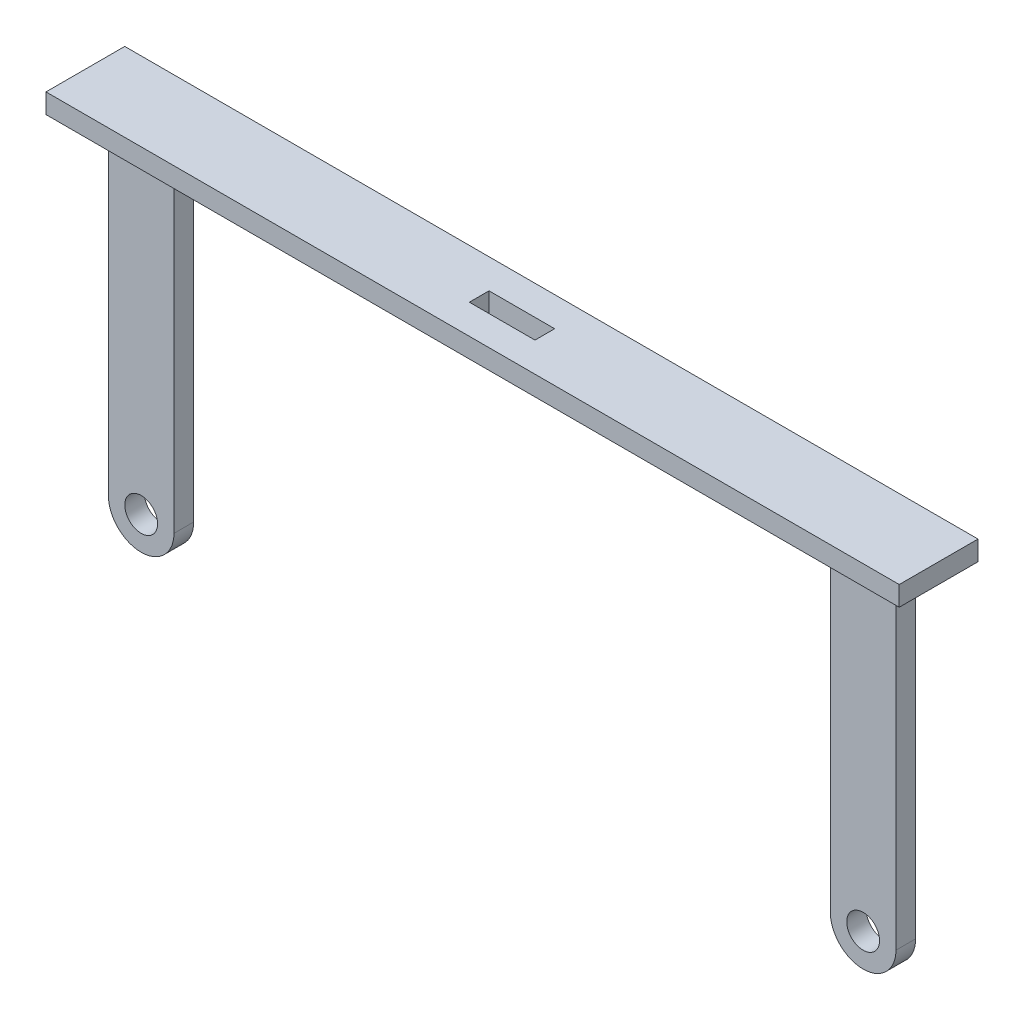
ISO-10303-21;
HEADER;
FILE_DESCRIPTION(('STEP AP214'),'2;1');
FILE_NAME('part.step','',(''),(''),'','','');
FILE_SCHEMA(('AUTOMOTIVE_DESIGN { 1 0 10303 214 1 1 1 1 }'));
ENDSEC;
DATA;
#1=APPLICATION_CONTEXT('core data for automotive mechanical design processes');
#2=APPLICATION_PROTOCOL_DEFINITION('international standard','automotive_design',2000,#1);
#3=PRODUCT_CONTEXT('',#1,'mechanical');
#4=PRODUCT('Part','Part','',(#3));
#5=PRODUCT_RELATED_PRODUCT_CATEGORY('part','',(#4));
#6=PRODUCT_DEFINITION_FORMATION('','',#4);
#7=PRODUCT_DEFINITION_CONTEXT('part definition',#1,'design');
#8=PRODUCT_DEFINITION('design','',#6,#7);
#9=PRODUCT_DEFINITION_SHAPE('','',#8);
#10=(LENGTH_UNIT() NAMED_UNIT(*) SI_UNIT(.MILLI.,.METRE.));
#11=(NAMED_UNIT(*) PLANE_ANGLE_UNIT() SI_UNIT($,.RADIAN.));
#12=(NAMED_UNIT(*) SI_UNIT($,.STERADIAN.) SOLID_ANGLE_UNIT());
#13=UNCERTAINTY_MEASURE_WITH_UNIT(LENGTH_MEASURE(1.E-05),#10,'distance_accuracy_value','');
#14=(GEOMETRIC_REPRESENTATION_CONTEXT(3) GLOBAL_UNCERTAINTY_ASSIGNED_CONTEXT((#13)) GLOBAL_UNIT_ASSIGNED_CONTEXT((#10,
#11,#12)) REPRESENTATION_CONTEXT('',''));
#15=CARTESIAN_POINT('',(0.,0.,0.));
#16=DIRECTION('',(0.,0.,1.));
#17=DIRECTION('',(1.,0.,0.));
#18=AXIS2_PLACEMENT_3D('',#15,#16,#17);
#19=CARTESIAN_POINT('',(0.,0.,3.));
#20=DIRECTION('',(0.,0.,1.));
#21=DIRECTION('',(1.,0.,0.));
#22=AXIS2_PLACEMENT_3D('',#19,#20,#21);
#23=PLANE('',#22);
#24=CARTESIAN_POINT('',(55.,-51.5,3.));
#25=DIRECTION('',(0.,0.,1.));
#26=DIRECTION('',(1.,0.,0.));
#27=AXIS2_PLACEMENT_3D('',#24,#25,#26);
#28=CIRCLE('',#27,2.5);
#29=CARTESIAN_POINT('',(57.5,-51.5,3.));
#30=VERTEX_POINT('',#29);
#31=EDGE_CURVE('E231',#30,#30,#28,.F.);
#32=ORIENTED_EDGE('',*,*,#31,.T.);
#33=EDGE_LOOP('',(#32));
#34=FACE_BOUND('',#33,.T.);
#35=DIRECTION('',(0.,-1.,0.));
#36=VECTOR('',#35,1.);
#37=CARTESIAN_POINT('',(60.,0.,3.));
#38=LINE('',#37,#36);
#39=CARTESIAN_POINT('',(60.,-1.49999999999999,3.));
#40=VERTEX_POINT('',#39);
#41=CARTESIAN_POINT('',(60.,-51.5,3.));
#42=VERTEX_POINT('',#41);
#43=EDGE_CURVE('E223',#40,#42,#38,.T.);
#44=ORIENTED_EDGE('',*,*,#43,.F.);
#45=DIRECTION('',(-1.,0.,0.));
#46=VECTOR('',#45,1.);
#47=CARTESIAN_POINT('',(0.,-1.5,3.));
#48=LINE('',#47,#46);
#49=CARTESIAN_POINT('',(50.,-1.49999999999999,3.));
#50=VERTEX_POINT('',#49);
#51=EDGE_CURVE('E208',#40,#50,#48,.T.);
#52=ORIENTED_EDGE('',*,*,#51,.T.);
#53=DIRECTION('',(0.,1.,0.));
#54=VECTOR('',#53,1.);
#55=CARTESIAN_POINT('',(50.,0.,3.));
#56=LINE('',#55,#54);
#57=CARTESIAN_POINT('',(50.,-51.5,3.));
#58=VERTEX_POINT('',#57);
#59=EDGE_CURVE('E217',#58,#50,#56,.T.);
#60=ORIENTED_EDGE('',*,*,#59,.F.);
#61=CARTESIAN_POINT('',(55.,-51.5,3.));
#62=DIRECTION('',(0.,0.,1.));
#63=DIRECTION('',(1.,0.,0.));
#64=AXIS2_PLACEMENT_3D('',#61,#62,#63);
#65=CIRCLE('',#64,5.);
#66=EDGE_CURVE('E220',#42,#58,#65,.F.);
#67=ORIENTED_EDGE('',*,*,#66,.F.);
#68=EDGE_LOOP('',(#44,#52,#60,#67));
#69=FACE_BOUND('',#68,.T.);
#70=ADVANCED_FACE('F35',(#34,#69),#23,.T.);
#71=CARTESIAN_POINT('',(-55.,-51.5,3.));
#72=DIRECTION('',(0.,0.,1.));
#73=DIRECTION('',(1.,0.,0.));
#74=AXIS2_PLACEMENT_3D('',#71,#72,#73);
#75=CIRCLE('',#74,2.5);
#76=CARTESIAN_POINT('',(-52.5,-51.5,3.));
#77=VERTEX_POINT('',#76);
#78=EDGE_CURVE('E228',#77,#77,#75,.T.);
#79=ORIENTED_EDGE('',*,*,#78,.F.);
#80=EDGE_LOOP('',(#79));
#81=FACE_BOUND('',#80,.T.);
#82=DIRECTION('',(0.,1.,0.));
#83=VECTOR('',#82,1.);
#84=CARTESIAN_POINT('',(-50.,0.,3.));
#85=LINE('',#84,#83);
#86=CARTESIAN_POINT('',(-50.,-51.5,3.));
#87=VERTEX_POINT('',#86);
#88=CARTESIAN_POINT('',(-50.,-1.50000000000001,3.));
#89=VERTEX_POINT('',#88);
#90=EDGE_CURVE('E214',#87,#89,#85,.T.);
#91=ORIENTED_EDGE('',*,*,#90,.T.);
#92=CARTESIAN_POINT('',(-60.,-1.50000000000001,3.));
#93=VERTEX_POINT('',#92);
#94=EDGE_CURVE('E199',#89,#93,#48,.T.);
#95=ORIENTED_EDGE('',*,*,#94,.T.);
#96=DIRECTION('',(0.,-1.,0.));
#97=VECTOR('',#96,1.);
#98=CARTESIAN_POINT('',(-60.,0.,3.));
#99=LINE('',#98,#97);
#100=CARTESIAN_POINT('',(-60.,-51.5,3.));
#101=VERTEX_POINT('',#100);
#102=EDGE_CURVE('E226',#93,#101,#99,.T.);
#103=ORIENTED_EDGE('',*,*,#102,.T.);
#104=CARTESIAN_POINT('',(-55.,-51.5,3.));
#105=DIRECTION('',(0.,0.,1.));
#106=DIRECTION('',(1.,0.,0.));
#107=AXIS2_PLACEMENT_3D('',#104,#105,#106);
#108=CIRCLE('',#107,5.);
#109=EDGE_CURVE('E211',#101,#87,#108,.T.);
#110=ORIENTED_EDGE('',*,*,#109,.T.);
#111=EDGE_LOOP('',(#91,#95,#103,#110));
#112=FACE_BOUND('',#111,.T.);
#113=ADVANCED_FACE('F301',(#81,#112),#23,.T.);
#114=CARTESIAN_POINT('',(0.,0.,0.));
#115=DIRECTION('',(0.,0.,1.));
#116=DIRECTION('',(1.,0.,0.));
#117=AXIS2_PLACEMENT_3D('',#114,#115,#116);
#118=PLANE('',#117);
#119=CARTESIAN_POINT('',(55.,-51.5,0.));
#120=DIRECTION('',(0.,0.,1.));
#121=DIRECTION('',(1.,0.,0.));
#122=AXIS2_PLACEMENT_3D('',#119,#120,#121);
#123=CIRCLE('',#122,2.5);
#124=CARTESIAN_POINT('',(57.5,-51.5,0.));
#125=VERTEX_POINT('',#124);
#126=EDGE_CURVE('E215',#125,#125,#123,.F.);
#127=ORIENTED_EDGE('',*,*,#126,.F.);
#128=EDGE_LOOP('',(#127));
#129=FACE_BOUND('',#128,.T.);
#130=DIRECTION('',(-1.,0.,0.));
#131=VECTOR('',#130,1.);
#132=CARTESIAN_POINT('',(0.,-1.5,0.));
#133=LINE('',#132,#131);
#134=CARTESIAN_POINT('',(60.,-1.49999999999999,0.));
#135=VERTEX_POINT('',#134);
#136=CARTESIAN_POINT('',(50.,-1.49999999999999,0.));
#137=VERTEX_POINT('',#136);
#138=EDGE_CURVE('E11',#135,#137,#133,.T.);
#139=ORIENTED_EDGE('',*,*,#138,.F.);
#140=DIRECTION('',(0.,-1.,0.));
#141=VECTOR('',#140,1.);
#142=CARTESIAN_POINT('',(60.,0.,0.));
#143=LINE('',#142,#141);
#144=CARTESIAN_POINT('',(60.,-51.5,0.));
#145=VERTEX_POINT('',#144);
#146=EDGE_CURVE('E246',#135,#145,#143,.T.);
#147=ORIENTED_EDGE('',*,*,#146,.T.);
#148=CARTESIAN_POINT('',(55.,-51.5,0.));
#149=DIRECTION('',(0.,0.,1.));
#150=DIRECTION('',(1.,0.,0.));
#151=AXIS2_PLACEMENT_3D('',#148,#149,#150);
#152=CIRCLE('',#151,5.);
#153=CARTESIAN_POINT('',(50.,-51.5,0.));
#154=VERTEX_POINT('',#153);
#155=EDGE_CURVE('E243',#145,#154,#152,.F.);
#156=ORIENTED_EDGE('',*,*,#155,.T.);
#157=DIRECTION('',(0.,1.,0.));
#158=VECTOR('',#157,1.);
#159=CARTESIAN_POINT('',(50.,0.,0.));
#160=LINE('',#159,#158);
#161=EDGE_CURVE('E240',#154,#137,#160,.T.);
#162=ORIENTED_EDGE('',*,*,#161,.T.);
#163=EDGE_LOOP('',(#139,#147,#156,#162));
#164=FACE_BOUND('',#163,.T.);
#165=ADVANCED_FACE('F318',(#129,#164),#118,.F.);
#166=CARTESIAN_POINT('',(-55.,-51.5,0.));
#167=DIRECTION('',(0.,0.,1.));
#168=DIRECTION('',(1.,0.,0.));
#169=AXIS2_PLACEMENT_3D('',#166,#167,#168);
#170=CIRCLE('',#169,2.5);
#171=CARTESIAN_POINT('',(-52.5,-51.5,0.));
#172=VERTEX_POINT('',#171);
#173=EDGE_CURVE('E251',#172,#172,#170,.T.);
#174=ORIENTED_EDGE('',*,*,#173,.T.);
#175=EDGE_LOOP('',(#174));
#176=FACE_BOUND('',#175,.T.);
#177=CARTESIAN_POINT('',(-50.,-1.50000000000001,0.));
#178=VERTEX_POINT('',#177);
#179=CARTESIAN_POINT('',(-60.,-1.50000000000001,0.));
#180=VERTEX_POINT('',#179);
#181=EDGE_CURVE('E39',#178,#180,#133,.T.);
#182=ORIENTED_EDGE('',*,*,#181,.F.);
#183=DIRECTION('',(0.,1.,0.));
#184=VECTOR('',#183,1.);
#185=CARTESIAN_POINT('',(-50.,0.,0.));
#186=LINE('',#185,#184);
#187=CARTESIAN_POINT('',(-50.,-51.5,0.));
#188=VERTEX_POINT('',#187);
#189=EDGE_CURVE('E237',#188,#178,#186,.T.);
#190=ORIENTED_EDGE('',*,*,#189,.F.);
#191=CARTESIAN_POINT('',(-55.,-51.5,0.));
#192=DIRECTION('',(0.,0.,1.));
#193=DIRECTION('',(1.,0.,0.));
#194=AXIS2_PLACEMENT_3D('',#191,#192,#193);
#195=CIRCLE('',#194,5.);
#196=CARTESIAN_POINT('',(-60.,-51.5,0.));
#197=VERTEX_POINT('',#196);
#198=EDGE_CURVE('E210',#197,#188,#195,.T.);
#199=ORIENTED_EDGE('',*,*,#198,.F.);
#200=DIRECTION('',(0.,-1.,0.));
#201=VECTOR('',#200,1.);
#202=CARTESIAN_POINT('',(-60.,0.,0.));
#203=LINE('',#202,#201);
#204=EDGE_CURVE('E249',#180,#197,#203,.T.);
#205=ORIENTED_EDGE('',*,*,#204,.F.);
#206=EDGE_LOOP('',(#182,#190,#199,#205));
#207=FACE_BOUND('',#206,.T.);
#208=ADVANCED_FACE('F297',(#176,#207),#118,.F.);
#209=CARTESIAN_POINT('',(-55.,-51.5,3.));
#210=DIRECTION('',(0.,0.,-1.));
#211=DIRECTION('',(-1.,0.,0.));
#212=AXIS2_PLACEMENT_3D('',#209,#210,#211);
#213=CYLINDRICAL_SURFACE('',#212,5.);
#214=ORIENTED_EDGE('',*,*,#198,.T.);
#215=DIRECTION('',(0.,0.,-1.));
#216=VECTOR('',#215,1.);
#217=CARTESIAN_POINT('',(-50.,-51.5,3.));
#218=LINE('',#217,#216);
#219=EDGE_CURVE('E281',#87,#188,#218,.T.);
#220=ORIENTED_EDGE('',*,*,#219,.F.);
#221=ORIENTED_EDGE('',*,*,#109,.F.);
#222=DIRECTION('',(0.,0.,-1.));
#223=VECTOR('',#222,1.);
#224=CARTESIAN_POINT('',(-60.,-51.5,3.));
#225=LINE('',#224,#223);
#226=EDGE_CURVE('E234',#101,#197,#225,.T.);
#227=ORIENTED_EDGE('',*,*,#226,.T.);
#228=EDGE_LOOP('',(#214,#220,#221,#227));
#229=FACE_BOUND('',#228,.T.);
#230=ADVANCED_FACE('F37',(#229),#213,.T.);
#231=CARTESIAN_POINT('',(-50.,0.,3.));
#232=DIRECTION('',(-1.,0.,0.));
#233=DIRECTION('',(0.,0.,1.));
#234=AXIS2_PLACEMENT_3D('',#231,#232,#233);
#235=PLANE('',#234);
#236=ORIENTED_EDGE('',*,*,#189,.T.);
#237=DIRECTION('',(0.,0.,-1.));
#238=VECTOR('',#237,1.);
#239=CARTESIAN_POINT('',(-50.,-1.50000000000001,3.));
#240=LINE('',#239,#238);
#241=EDGE_CURVE('E279',#89,#178,#240,.T.);
#242=ORIENTED_EDGE('',*,*,#241,.F.);
#243=ORIENTED_EDGE('',*,*,#90,.F.);
#244=ORIENTED_EDGE('',*,*,#219,.T.);
#245=EDGE_LOOP('',(#236,#242,#243,#244));
#246=FACE_BOUND('',#245,.T.);
#247=ADVANCED_FACE('F302',(#246),#235,.F.);
#248=CARTESIAN_POINT('',(50.,0.,3.));
#249=DIRECTION('',(-1.,0.,0.));
#250=DIRECTION('',(0.,0.,1.));
#251=AXIS2_PLACEMENT_3D('',#248,#249,#250);
#252=PLANE('',#251);
#253=ORIENTED_EDGE('',*,*,#161,.F.);
#254=DIRECTION('',(0.,0.,-1.));
#255=VECTOR('',#254,1.);
#256=CARTESIAN_POINT('',(50.,-51.5,3.));
#257=LINE('',#256,#255);
#258=EDGE_CURVE('E274',#58,#154,#257,.T.);
#259=ORIENTED_EDGE('',*,*,#258,.F.);
#260=ORIENTED_EDGE('',*,*,#59,.T.);
#261=DIRECTION('',(0.,0.,-1.));
#262=VECTOR('',#261,1.);
#263=CARTESIAN_POINT('',(50.,-1.49999999999999,3.));
#264=LINE('',#263,#262);
#265=EDGE_CURVE('E276',#50,#137,#264,.T.);
#266=ORIENTED_EDGE('',*,*,#265,.T.);
#267=EDGE_LOOP('',(#253,#259,#260,#266));
#268=FACE_BOUND('',#267,.T.);
#269=ADVANCED_FACE('F304',(#268),#252,.T.);
#270=CARTESIAN_POINT('',(55.,-51.5,3.));
#271=DIRECTION('',(0.,0.,-1.));
#272=DIRECTION('',(-1.,0.,0.));
#273=AXIS2_PLACEMENT_3D('',#270,#271,#272);
#274=CYLINDRICAL_SURFACE('',#273,5.);
#275=ORIENTED_EDGE('',*,*,#155,.F.);
#276=DIRECTION('',(0.,0.,-1.));
#277=VECTOR('',#276,1.);
#278=CARTESIAN_POINT('',(60.,-51.5,3.));
#279=LINE('',#278,#277);
#280=EDGE_CURVE('E272',#42,#145,#279,.T.);
#281=ORIENTED_EDGE('',*,*,#280,.F.);
#282=ORIENTED_EDGE('',*,*,#66,.T.);
#283=ORIENTED_EDGE('',*,*,#258,.T.);
#284=EDGE_LOOP('',(#275,#281,#282,#283));
#285=FACE_BOUND('',#284,.T.);
#286=ADVANCED_FACE('F309',(#285),#274,.T.);
#287=CARTESIAN_POINT('',(60.,0.,3.));
#288=DIRECTION('',(1.,0.,0.));
#289=DIRECTION('',(0.,1.,0.));
#290=AXIS2_PLACEMENT_3D('',#287,#288,#289);
#291=PLANE('',#290);
#292=ORIENTED_EDGE('',*,*,#146,.F.);
#293=DIRECTION('',(0.,0.,-1.));
#294=VECTOR('',#293,1.);
#295=CARTESIAN_POINT('',(60.,-1.49999999999999,3.));
#296=LINE('',#295,#294);
#297=EDGE_CURVE('E269',#40,#135,#296,.T.);
#298=ORIENTED_EDGE('',*,*,#297,.F.);
#299=ORIENTED_EDGE('',*,*,#43,.T.);
#300=ORIENTED_EDGE('',*,*,#280,.T.);
#301=EDGE_LOOP('',(#292,#298,#299,#300));
#302=FACE_BOUND('',#301,.T.);
#303=ADVANCED_FACE('F352',(#302),#291,.T.);
#304=CARTESIAN_POINT('',(65.,0.,3.));
#305=DIRECTION('',(-1.,0.,0.));
#306=DIRECTION('',(0.,0.,1.));
#307=AXIS2_PLACEMENT_3D('',#304,#305,#306);
#308=PLANE('',#307);
#309=DIRECTION('',(0.,0.,-1.));
#310=VECTOR('',#309,1.);
#311=CARTESIAN_POINT('',(65.,-1.49999999999999,3.));
#312=LINE('',#311,#310);
#313=CARTESIAN_POINT('',(65.,-1.49999999999999,7.49999999999998));
#314=VERTEX_POINT('',#313);
#315=CARTESIAN_POINT('',(65.,-1.49999999999999,-4.50000000000002));
#316=VERTEX_POINT('',#315);
#317=EDGE_CURVE('E267',#314,#316,#312,.T.);
#318=ORIENTED_EDGE('',*,*,#317,.T.);
#319=DIRECTION('',(0.,1.,0.));
#320=VECTOR('',#319,1.);
#321=CARTESIAN_POINT('',(65.,-1.49999999999999,-4.50000000000002));
#322=LINE('',#321,#320);
#323=CARTESIAN_POINT('',(65.,1.50000000000001,-4.50000000000002));
#324=VERTEX_POINT('',#323);
#325=EDGE_CURVE('E200',#316,#324,#322,.T.);
#326=ORIENTED_EDGE('',*,*,#325,.T.);
#327=DIRECTION('',(0.,0.,-1.));
#328=VECTOR('',#327,1.);
#329=CARTESIAN_POINT('',(65.,1.50000000000001,3.));
#330=LINE('',#329,#328);
#331=CARTESIAN_POINT('',(65.,1.50000000000001,7.49999999999998));
#332=VERTEX_POINT('',#331);
#333=EDGE_CURVE('E265',#332,#324,#330,.T.);
#334=ORIENTED_EDGE('',*,*,#333,.F.);
#335=DIRECTION('',(0.,1.,0.));
#336=VECTOR('',#335,1.);
#337=CARTESIAN_POINT('',(65.,-1.49999999999999,7.49999999999998));
#338=LINE('',#337,#336);
#339=EDGE_CURVE('E203',#314,#332,#338,.T.);
#340=ORIENTED_EDGE('',*,*,#339,.F.);
#341=EDGE_LOOP('',(#318,#326,#334,#340));
#342=FACE_BOUND('',#341,.T.);
#343=ADVANCED_FACE('F348',(#342),#308,.F.);
#344=CARTESIAN_POINT('',(0.,1.5,3.));
#345=DIRECTION('',(0.,-1.,0.));
#346=DIRECTION('',(1.,0.,0.));
#347=AXIS2_PLACEMENT_3D('',#344,#345,#346);
#348=PLANE('',#347);
#349=DIRECTION('',(1.,0.,0.));
#350=VECTOR('',#349,1.);
#351=CARTESIAN_POINT('',(4.99999999999999,1.5,2.99999999999998));
#352=LINE('',#351,#350);
#353=CARTESIAN_POINT('',(-5.00000000000001,1.5,3.));
#354=VERTEX_POINT('',#353);
#355=CARTESIAN_POINT('',(4.99999999999999,1.5,2.99999999999998));
#356=VERTEX_POINT('',#355);
#357=EDGE_CURVE('E174',#354,#356,#352,.T.);
#358=ORIENTED_EDGE('',*,*,#357,.F.);
#359=DIRECTION('',(0.,0.,1.));
#360=VECTOR('',#359,1.);
#361=CARTESIAN_POINT('',(-5.00000000000001,1.5,2.99999999999998));
#362=LINE('',#361,#360);
#363=CARTESIAN_POINT('',(-5.00000000000001,1.5,0.));
#364=VERTEX_POINT('',#363);
#365=EDGE_CURVE('E50',#364,#354,#362,.T.);
#366=ORIENTED_EDGE('',*,*,#365,.F.);
#367=DIRECTION('',(-1.,0.,0.));
#368=VECTOR('',#367,1.);
#369=CARTESIAN_POINT('',(4.99999999999999,1.5,0.));
#370=LINE('',#369,#368);
#371=CARTESIAN_POINT('',(4.99999999999999,1.5,0.));
#372=VERTEX_POINT('',#371);
#373=EDGE_CURVE('E165',#372,#364,#370,.T.);
#374=ORIENTED_EDGE('',*,*,#373,.F.);
#375=DIRECTION('',(0.,0.,-1.));
#376=VECTOR('',#375,1.);
#377=CARTESIAN_POINT('',(4.99999999999999,1.5,2.99999999999998));
#378=LINE('',#377,#376);
#379=EDGE_CURVE('E168',#356,#372,#378,.T.);
#380=ORIENTED_EDGE('',*,*,#379,.F.);
#381=EDGE_LOOP('',(#358,#366,#374,#380));
#382=FACE_BOUND('',#381,.T.);
#383=ORIENTED_EDGE('',*,*,#333,.T.);
#384=DIRECTION('',(-1.,0.,0.));
#385=VECTOR('',#384,1.);
#386=CARTESIAN_POINT('',(65.,1.50000000000001,-4.50000000000002));
#387=LINE('',#386,#385);
#388=CARTESIAN_POINT('',(-65.,1.49999999999999,-4.5));
#389=VERTEX_POINT('',#388);
#390=EDGE_CURVE('E188',#324,#389,#387,.T.);
#391=ORIENTED_EDGE('',*,*,#390,.T.);
#392=DIRECTION('',(0.,0.,-1.));
#393=VECTOR('',#392,1.);
#394=CARTESIAN_POINT('',(-65.,1.49999999999999,3.));
#395=LINE('',#394,#393);
#396=CARTESIAN_POINT('',(-65.,1.49999999999999,7.5));
#397=VERTEX_POINT('',#396);
#398=EDGE_CURVE('E263',#397,#389,#395,.T.);
#399=ORIENTED_EDGE('',*,*,#398,.F.);
#400=DIRECTION('',(1.,0.,0.));
#401=VECTOR('',#400,1.);
#402=CARTESIAN_POINT('',(65.,1.50000000000001,7.49999999999998));
#403=LINE('',#402,#401);
#404=EDGE_CURVE('E180',#397,#332,#403,.T.);
#405=ORIENTED_EDGE('',*,*,#404,.T.);
#406=EDGE_LOOP('',(#383,#391,#399,#405));
#407=FACE_BOUND('',#406,.T.);
#408=ADVANCED_FACE('F344',(#382,#407),#348,.F.);
#409=CARTESIAN_POINT('',(-65.,0.,3.));
#410=DIRECTION('',(-1.,0.,0.));
#411=DIRECTION('',(0.,0.,1.));
#412=AXIS2_PLACEMENT_3D('',#409,#410,#411);
#413=PLANE('',#412);
#414=ORIENTED_EDGE('',*,*,#398,.T.);
#415=DIRECTION('',(0.,1.,0.));
#416=VECTOR('',#415,1.);
#417=CARTESIAN_POINT('',(-65.,-1.50000000000001,-4.5));
#418=LINE('',#417,#416);
#419=CARTESIAN_POINT('',(-65.,-1.50000000000001,-4.5));
#420=VERTEX_POINT('',#419);
#421=EDGE_CURVE('E196',#420,#389,#418,.T.);
#422=ORIENTED_EDGE('',*,*,#421,.F.);
#423=DIRECTION('',(0.,0.,-1.));
#424=VECTOR('',#423,1.);
#425=CARTESIAN_POINT('',(-65.,-1.50000000000001,3.));
#426=LINE('',#425,#424);
#427=CARTESIAN_POINT('',(-65.,-1.50000000000001,7.5));
#428=VERTEX_POINT('',#427);
#429=EDGE_CURVE('E261',#428,#420,#426,.T.);
#430=ORIENTED_EDGE('',*,*,#429,.F.);
#431=DIRECTION('',(0.,1.,0.));
#432=VECTOR('',#431,1.);
#433=CARTESIAN_POINT('',(-65.,-1.50000000000001,7.5));
#434=LINE('',#433,#432);
#435=EDGE_CURVE('E191',#428,#397,#434,.T.);
#436=ORIENTED_EDGE('',*,*,#435,.T.);
#437=EDGE_LOOP('',(#414,#422,#430,#436));
#438=FACE_BOUND('',#437,.T.);
#439=ADVANCED_FACE('F341',(#438),#413,.T.);
#440=CARTESIAN_POINT('',(0.,-1.5,3.));
#441=DIRECTION('',(0.,-1.,0.));
#442=DIRECTION('',(1.,0.,0.));
#443=AXIS2_PLACEMENT_3D('',#440,#441,#442);
#444=PLANE('',#443);
#445=DIRECTION('',(0.,0.,1.));
#446=VECTOR('',#445,1.);
#447=CARTESIAN_POINT('',(-5.00000000000001,-1.5,2.99999999999998));
#448=LINE('',#447,#446);
#449=CARTESIAN_POINT('',(-5.00000000000001,-1.5,0.));
#450=VERTEX_POINT('',#449);
#451=CARTESIAN_POINT('',(-5.00000000000001,-1.5,2.99999999999998));
#452=VERTEX_POINT('',#451);
#453=EDGE_CURVE('E149',#450,#452,#448,.T.);
#454=ORIENTED_EDGE('',*,*,#453,.T.);
#455=DIRECTION('',(1.,0.,0.));
#456=VECTOR('',#455,1.);
#457=CARTESIAN_POINT('',(4.99999999999999,-1.5,2.99999999999998));
#458=LINE('',#457,#456);
#459=CARTESIAN_POINT('',(4.99999999999999,-1.5,3.));
#460=VERTEX_POINT('',#459);
#461=EDGE_CURVE('E158',#452,#460,#458,.T.);
#462=ORIENTED_EDGE('',*,*,#461,.T.);
#463=DIRECTION('',(0.,0.,-1.));
#464=VECTOR('',#463,1.);
#465=CARTESIAN_POINT('',(4.99999999999999,-1.5,2.99999999999998));
#466=LINE('',#465,#464);
#467=CARTESIAN_POINT('',(4.99999999999999,-1.5,0.));
#468=VERTEX_POINT('',#467);
#469=EDGE_CURVE('E58',#460,#468,#466,.T.);
#470=ORIENTED_EDGE('',*,*,#469,.T.);
#471=DIRECTION('',(-1.,0.,0.));
#472=VECTOR('',#471,1.);
#473=CARTESIAN_POINT('',(4.99999999999999,-1.5,0.));
#474=LINE('',#473,#472);
#475=EDGE_CURVE('E155',#468,#450,#474,.T.);
#476=ORIENTED_EDGE('',*,*,#475,.T.);
#477=EDGE_LOOP('',(#454,#462,#470,#476));
#478=FACE_BOUND('',#477,.T.);
#479=ORIENTED_EDGE('',*,*,#51,.F.);
#480=ORIENTED_EDGE('',*,*,#297,.T.);
#481=ORIENTED_EDGE('',*,*,#138,.T.);
#482=ORIENTED_EDGE('',*,*,#265,.F.);
#483=EDGE_LOOP('',(#479,#480,#481,#482));
#484=FACE_BOUND('',#483,.T.);
#485=ORIENTED_EDGE('',*,*,#94,.F.);
#486=ORIENTED_EDGE('',*,*,#241,.T.);
#487=ORIENTED_EDGE('',*,*,#181,.T.);
#488=DIRECTION('',(0.,0.,-1.));
#489=VECTOR('',#488,1.);
#490=CARTESIAN_POINT('',(-60.,-1.50000000000001,3.));
#491=LINE('',#490,#489);
#492=EDGE_CURVE('E258',#93,#180,#491,.T.);
#493=ORIENTED_EDGE('',*,*,#492,.F.);
#494=EDGE_LOOP('',(#485,#486,#487,#493));
#495=FACE_BOUND('',#494,.T.);
#496=ORIENTED_EDGE('',*,*,#429,.T.);
#497=DIRECTION('',(-1.,0.,0.));
#498=VECTOR('',#497,1.);
#499=CARTESIAN_POINT('',(65.,-1.49999999999999,-4.50000000000002));
#500=LINE('',#499,#498);
#501=EDGE_CURVE('E187',#316,#420,#500,.T.);
#502=ORIENTED_EDGE('',*,*,#501,.F.);
#503=ORIENTED_EDGE('',*,*,#317,.F.);
#504=DIRECTION('',(1.,0.,0.));
#505=VECTOR('',#504,1.);
#506=CARTESIAN_POINT('',(65.,-1.49999999999999,7.49999999999998));
#507=LINE('',#506,#505);
#508=EDGE_CURVE('E184',#428,#314,#507,.T.);
#509=ORIENTED_EDGE('',*,*,#508,.F.);
#510=EDGE_LOOP('',(#496,#502,#503,#509));
#511=FACE_BOUND('',#510,.T.);
#512=ADVANCED_FACE('F162',(#478,#484,#495,#511),#444,.T.);
#513=CARTESIAN_POINT('',(-55.,-51.5,3.));
#514=DIRECTION('',(0.,0.,-1.));
#515=DIRECTION('',(-1.,0.,0.));
#516=AXIS2_PLACEMENT_3D('',#513,#514,#515);
#517=CYLINDRICAL_SURFACE('',#516,2.5);
#518=ORIENTED_EDGE('',*,*,#78,.T.);
#519=EDGE_LOOP('',(#518));
#520=FACE_BOUND('',#519,.T.);
#521=ORIENTED_EDGE('',*,*,#173,.F.);
#522=EDGE_LOOP('',(#521));
#523=FACE_BOUND('',#522,.T.);
#524=ADVANCED_FACE('F333',(#520,#523),#517,.F.);
#525=CARTESIAN_POINT('',(-60.,0.,3.));
#526=DIRECTION('',(1.,0.,0.));
#527=DIRECTION('',(0.,1.,0.));
#528=AXIS2_PLACEMENT_3D('',#525,#526,#527);
#529=PLANE('',#528);
#530=ORIENTED_EDGE('',*,*,#204,.T.);
#531=ORIENTED_EDGE('',*,*,#226,.F.);
#532=ORIENTED_EDGE('',*,*,#102,.F.);
#533=ORIENTED_EDGE('',*,*,#492,.T.);
#534=EDGE_LOOP('',(#530,#531,#532,#533));
#535=FACE_BOUND('',#534,.T.);
#536=ADVANCED_FACE('F294',(#535),#529,.F.);
#537=CARTESIAN_POINT('',(55.,-51.5,3.));
#538=DIRECTION('',(0.,0.,-1.));
#539=DIRECTION('',(-1.,0.,0.));
#540=AXIS2_PLACEMENT_3D('',#537,#538,#539);
#541=CYLINDRICAL_SURFACE('',#540,2.5);
#542=ORIENTED_EDGE('',*,*,#31,.F.);
#543=EDGE_LOOP('',(#542));
#544=FACE_BOUND('',#543,.T.);
#545=ORIENTED_EDGE('',*,*,#126,.T.);
#546=EDGE_LOOP('',(#545));
#547=FACE_BOUND('',#546,.T.);
#548=ADVANCED_FACE('F328',(#544,#547),#541,.F.);
#549=CARTESIAN_POINT('',(65.,-1.49999999999999,-4.50000000000002));
#550=DIRECTION('',(0.,0.,-1.));
#551=DIRECTION('',(-1.,0.,0.));
#552=AXIS2_PLACEMENT_3D('',#549,#550,#551);
#553=PLANE('',#552);
#554=ORIENTED_EDGE('',*,*,#390,.F.);
#555=ORIENTED_EDGE('',*,*,#325,.F.);
#556=ORIENTED_EDGE('',*,*,#501,.T.);
#557=ORIENTED_EDGE('',*,*,#421,.T.);
#558=EDGE_LOOP('',(#554,#555,#556,#557));
#559=FACE_BOUND('',#558,.T.);
#560=ADVANCED_FACE('F331',(#559),#553,.T.);
#561=CARTESIAN_POINT('',(65.,-1.49999999999999,7.49999999999998));
#562=DIRECTION('',(0.,0.,1.));
#563=DIRECTION('',(1.,0.,0.));
#564=AXIS2_PLACEMENT_3D('',#561,#562,#563);
#565=PLANE('',#564);
#566=ORIENTED_EDGE('',*,*,#404,.F.);
#567=ORIENTED_EDGE('',*,*,#435,.F.);
#568=ORIENTED_EDGE('',*,*,#508,.T.);
#569=ORIENTED_EDGE('',*,*,#339,.T.);
#570=EDGE_LOOP('',(#566,#567,#568,#569));
#571=FACE_BOUND('',#570,.T.);
#572=ADVANCED_FACE('F323',(#571),#565,.T.);
#573=CARTESIAN_POINT('',(-5.00000000000001,-1.5,2.99999999999998));
#574=DIRECTION('',(-1.,0.,0.));
#575=DIRECTION('',(0.,-1.,0.));
#576=AXIS2_PLACEMENT_3D('',#573,#574,#575);
#577=PLANE('',#576);
#578=ORIENTED_EDGE('',*,*,#365,.T.);
#579=DIRECTION('',(0.,1.,0.));
#580=VECTOR('',#579,1.);
#581=CARTESIAN_POINT('',(-5.00000000000001,-1.5,2.99999999999998));
#582=LINE('',#581,#580);
#583=EDGE_CURVE('E145',#452,#354,#582,.T.);
#584=ORIENTED_EDGE('',*,*,#583,.F.);
#585=ORIENTED_EDGE('',*,*,#453,.F.);
#586=DIRECTION('',(0.,1.,0.));
#587=VECTOR('',#586,1.);
#588=CARTESIAN_POINT('',(-5.00000000000001,-1.5,0.));
#589=LINE('',#588,#587);
#590=EDGE_CURVE('E178',#450,#364,#589,.T.);
#591=ORIENTED_EDGE('',*,*,#590,.T.);
#592=EDGE_LOOP('',(#578,#584,#585,#591));
#593=FACE_BOUND('',#592,.T.);
#594=ADVANCED_FACE('F147',(#593),#577,.F.);
#595=CARTESIAN_POINT('',(4.99999999999999,-1.5,0.));
#596=DIRECTION('',(0.,0.,-1.));
#597=DIRECTION('',(-1.,0.,0.));
#598=AXIS2_PLACEMENT_3D('',#595,#596,#597);
#599=PLANE('',#598);
#600=ORIENTED_EDGE('',*,*,#373,.T.);
#601=ORIENTED_EDGE('',*,*,#590,.F.);
#602=ORIENTED_EDGE('',*,*,#475,.F.);
#603=DIRECTION('',(0.,1.,0.));
#604=VECTOR('',#603,1.);
#605=CARTESIAN_POINT('',(4.99999999999999,-1.5,0.));
#606=LINE('',#605,#604);
#607=EDGE_CURVE('E181',#468,#372,#606,.T.);
#608=ORIENTED_EDGE('',*,*,#607,.T.);
#609=EDGE_LOOP('',(#600,#601,#602,#608));
#610=FACE_BOUND('',#609,.T.);
#611=ADVANCED_FACE('F423',(#610),#599,.F.);
#612=CARTESIAN_POINT('',(4.99999999999999,-1.5,2.99999999999998));
#613=DIRECTION('',(1.,0.,0.));
#614=DIRECTION('',(0.,1.,0.));
#615=AXIS2_PLACEMENT_3D('',#612,#613,#614);
#616=PLANE('',#615);
#617=ORIENTED_EDGE('',*,*,#379,.T.);
#618=ORIENTED_EDGE('',*,*,#607,.F.);
#619=ORIENTED_EDGE('',*,*,#469,.F.);
#620=DIRECTION('',(0.,1.,0.));
#621=VECTOR('',#620,1.);
#622=CARTESIAN_POINT('',(4.99999999999999,-1.5,2.99999999999998));
#623=LINE('',#622,#621);
#624=EDGE_CURVE('E154',#460,#356,#623,.T.);
#625=ORIENTED_EDGE('',*,*,#624,.T.);
#626=EDGE_LOOP('',(#617,#618,#619,#625));
#627=FACE_BOUND('',#626,.T.);
#628=ADVANCED_FACE('F430',(#627),#616,.F.);
#629=CARTESIAN_POINT('',(4.99999999999999,-1.5,2.99999999999998));
#630=DIRECTION('',(0.,0.,1.));
#631=DIRECTION('',(1.,0.,0.));
#632=AXIS2_PLACEMENT_3D('',#629,#630,#631);
#633=PLANE('',#632);
#634=ORIENTED_EDGE('',*,*,#357,.T.);
#635=ORIENTED_EDGE('',*,*,#624,.F.);
#636=ORIENTED_EDGE('',*,*,#461,.F.);
#637=ORIENTED_EDGE('',*,*,#583,.T.);
#638=EDGE_LOOP('',(#634,#635,#636,#637));
#639=FACE_BOUND('',#638,.T.);
#640=ADVANCED_FACE('F159',(#639),#633,.F.);
#641=CLOSED_SHELL('',(#70,#113,#165,#208,#230,#247,#269,#286,#303,#343,#408,#439,#512,#524,#536,
#548,#560,#572,#594,#611,#628,#640));
#642=MANIFOLD_SOLID_BREP('B2',#641);
#643=ADVANCED_BREP_SHAPE_REPRESENTATION('',(#18,#642),#14);
#644=SHAPE_DEFINITION_REPRESENTATION(#9,#643);
ENDSEC;
END-ISO-10303-21;
